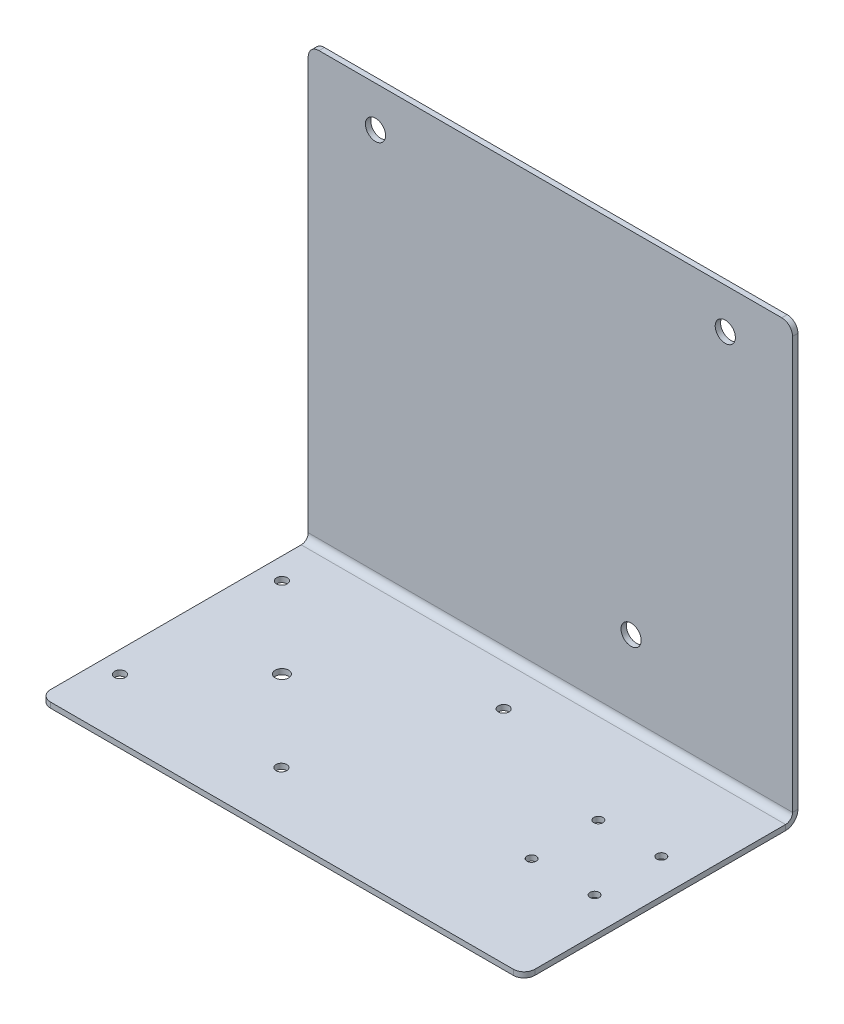
ISO-10303-21;
HEADER;
FILE_DESCRIPTION(('STEP AP214'),'2;1');
FILE_NAME('part.step','',(''),(''),'','','');
FILE_SCHEMA(('AUTOMOTIVE_DESIGN { 1 0 10303 214 1 1 1 1 }'));
ENDSEC;
DATA;
#1=APPLICATION_CONTEXT('core data for automotive mechanical design processes');
#2=APPLICATION_PROTOCOL_DEFINITION('international standard','automotive_design',2000,#1);
#3=PRODUCT_CONTEXT('',#1,'mechanical');
#4=PRODUCT('Part','Part','',(#3));
#5=PRODUCT_RELATED_PRODUCT_CATEGORY('part','',(#4));
#6=PRODUCT_DEFINITION_FORMATION('','',#4);
#7=PRODUCT_DEFINITION_CONTEXT('part definition',#1,'design');
#8=PRODUCT_DEFINITION('design','',#6,#7);
#9=PRODUCT_DEFINITION_SHAPE('','',#8);
#10=(LENGTH_UNIT() NAMED_UNIT(*) SI_UNIT(.MILLI.,.METRE.));
#11=(NAMED_UNIT(*) PLANE_ANGLE_UNIT() SI_UNIT($,.RADIAN.));
#12=(NAMED_UNIT(*) SI_UNIT($,.STERADIAN.) SOLID_ANGLE_UNIT());
#13=UNCERTAINTY_MEASURE_WITH_UNIT(LENGTH_MEASURE(1.E-05),#10,'distance_accuracy_value','');
#14=(GEOMETRIC_REPRESENTATION_CONTEXT(3) GLOBAL_UNCERTAINTY_ASSIGNED_CONTEXT((#13)) GLOBAL_UNIT_ASSIGNED_CONTEXT((#10,
#11,#12)) REPRESENTATION_CONTEXT('',''));
#15=CARTESIAN_POINT('',(0.,0.,0.));
#16=DIRECTION('',(0.,0.,1.));
#17=DIRECTION('',(1.,0.,0.));
#18=AXIS2_PLACEMENT_3D('',#15,#16,#17);
#19=CARTESIAN_POINT('',(114.3,-37.8111595969466,124.171159596947));
#20=DIRECTION('',(-1.,0.,0.));
#21=DIRECTION('',(0.,0.,-1.));
#22=AXIS2_PLACEMENT_3D('',#19,#20,#21);
#23=PLANE('',#22);
#24=DIRECTION('',(0.,0.,-1.));
#25=VECTOR('',#24,1.);
#26=CARTESIAN_POINT('',(114.3,-40.3511595969466,124.171159596947));
#27=LINE('',#26,#25);
#28=CARTESIAN_POINT('',(114.3,-40.3511595969466,124.171159596947));
#29=VERTEX_POINT('',#28);
#30=CARTESIAN_POINT('',(114.3,-40.351159596947,5.84199999999998));
#31=VERTEX_POINT('',#30);
#32=EDGE_CURVE('E69',#29,#31,#27,.T.);
#33=ORIENTED_EDGE('',*,*,#32,.T.);
#34=DIRECTION('',(0.,1.,0.));
#35=VECTOR('',#34,1.);
#36=CARTESIAN_POINT('',(114.3,-37.8111595969462,5.84199999999999));
#37=LINE('',#36,#35);
#38=CARTESIAN_POINT('',(114.3,-37.811159596947,5.84200000000001));
#39=VERTEX_POINT('',#38);
#40=EDGE_CURVE('E134',#31,#39,#37,.T.);
#41=ORIENTED_EDGE('',*,*,#40,.T.);
#42=DIRECTION('',(0.,0.,-1.));
#43=VECTOR('',#42,1.);
#44=CARTESIAN_POINT('',(114.3,-37.8111595969466,124.171159596947));
#45=LINE('',#44,#43);
#46=CARTESIAN_POINT('',(114.3,-37.8111595969466,124.171159596947));
#47=VERTEX_POINT('',#46);
#48=EDGE_CURVE('E136',#47,#39,#45,.T.);
#49=ORIENTED_EDGE('',*,*,#48,.F.);
#50=DIRECTION('',(0.,1.,0.));
#51=VECTOR('',#50,1.);
#52=CARTESIAN_POINT('',(114.3,-37.8111595969466,124.171159596947));
#53=LINE('',#52,#51);
#54=EDGE_CURVE('E238',#29,#47,#53,.T.);
#55=ORIENTED_EDGE('',*,*,#54,.F.);
#56=EDGE_LOOP('',(#33,#41,#49,#55));
#57=FACE_BOUND('',#56,.T.);
#58=ADVANCED_FACE('F45',(#57),#23,.F.);
#59=CARTESIAN_POINT('',(-114.3,-37.8111595969466,124.171159596947));
#60=DIRECTION('',(1.,0.,0.));
#61=DIRECTION('',(0.,0.,1.));
#62=AXIS2_PLACEMENT_3D('',#59,#60,#61);
#63=PLANE('',#62);
#64=DIRECTION('',(0.,0.,1.));
#65=VECTOR('',#64,1.);
#66=CARTESIAN_POINT('',(-114.3,-37.8111595969466,124.171159596947));
#67=LINE('',#66,#65);
#68=CARTESIAN_POINT('',(-114.3,-37.811159596947,5.84199999999999));
#69=VERTEX_POINT('',#68);
#70=CARTESIAN_POINT('',(-114.3,-37.8111595969466,124.171159596947));
#71=VERTEX_POINT('',#70);
#72=EDGE_CURVE('E49',#69,#71,#67,.T.);
#73=ORIENTED_EDGE('',*,*,#72,.F.);
#74=DIRECTION('',(0.,-1.,0.));
#75=VECTOR('',#74,1.);
#76=CARTESIAN_POINT('',(-114.3,-37.8111595969462,5.84199999999999));
#77=LINE('',#76,#75);
#78=CARTESIAN_POINT('',(-114.3,-40.351159596947,5.84199999999998));
#79=VERTEX_POINT('',#78);
#80=EDGE_CURVE('E12',#69,#79,#77,.T.);
#81=ORIENTED_EDGE('',*,*,#80,.T.);
#82=DIRECTION('',(0.,0.,-1.));
#83=VECTOR('',#82,1.);
#84=CARTESIAN_POINT('',(-114.3,-40.3511595969466,124.171159596947));
#85=LINE('',#84,#83);
#86=CARTESIAN_POINT('',(-114.3,-40.3511595969466,124.171159596947));
#87=VERTEX_POINT('',#86);
#88=EDGE_CURVE('E62',#79,#87,#85,.F.);
#89=ORIENTED_EDGE('',*,*,#88,.T.);
#90=DIRECTION('',(0.,1.,0.));
#91=VECTOR('',#90,1.);
#92=CARTESIAN_POINT('',(-114.3,-37.8111595969466,124.171159596947));
#93=LINE('',#92,#91);
#94=EDGE_CURVE('E235',#87,#71,#93,.T.);
#95=ORIENTED_EDGE('',*,*,#94,.T.);
#96=EDGE_LOOP('',(#73,#81,#89,#95));
#97=FACE_BOUND('',#96,.T.);
#98=ADVANCED_FACE('F47',(#97),#63,.F.);
#99=CARTESIAN_POINT('',(-109.22,-40.3511595969466,124.171159596947));
#100=DIRECTION('',(0.,-1.,0.));
#101=DIRECTION('',(-1.,0.,0.));
#102=AXIS2_PLACEMENT_3D('',#99,#100,#101);
#103=PLANE('',#102);
#104=CARTESIAN_POINT('',(98.044,-40.3511595969467,79.7211595969469));
#105=DIRECTION('',(0.,1.,0.));
#106=DIRECTION('',(0.,0.,1.));
#107=AXIS2_PLACEMENT_3D('',#104,#105,#106);
#108=CIRCLE('',#107,2.15899999999999);
#109=CARTESIAN_POINT('',(98.044,-40.3511595969467,81.8801595969469));
#110=VERTEX_POINT('',#109);
#111=EDGE_CURVE('E713',#110,#110,#108,.T.);
#112=ORIENTED_EDGE('',*,*,#111,.T.);
#113=EDGE_LOOP('',(#112));
#114=FACE_BOUND('',#113,.T.);
#115=CARTESIAN_POINT('',(98.044,-40.3511595969469,48.2251595969469));
#116=DIRECTION('',(0.,1.,0.));
#117=DIRECTION('',(0.,0.,1.));
#118=AXIS2_PLACEMENT_3D('',#115,#116,#117);
#119=CIRCLE('',#118,2.15899999999999);
#120=CARTESIAN_POINT('',(98.044,-40.3511595969468,50.3841595969468));
#121=VERTEX_POINT('',#120);
#122=EDGE_CURVE('E707',#121,#121,#119,.T.);
#123=ORIENTED_EDGE('',*,*,#122,.T.);
#124=EDGE_LOOP('',(#123));
#125=FACE_BOUND('',#124,.T.);
#126=CARTESIAN_POINT('',(68.326,-40.3511595969469,48.2251595969469));
#127=DIRECTION('',(0.,1.,0.));
#128=DIRECTION('',(0.,0.,1.));
#129=AXIS2_PLACEMENT_3D('',#126,#127,#128);
#130=CIRCLE('',#129,2.15900000000001);
#131=CARTESIAN_POINT('',(68.326,-40.3511595969468,50.3841595969469));
#132=VERTEX_POINT('',#131);
#133=EDGE_CURVE('E701',#132,#132,#130,.T.);
#134=ORIENTED_EDGE('',*,*,#133,.T.);
#135=EDGE_LOOP('',(#134));
#136=FACE_BOUND('',#135,.T.);
#137=CARTESIAN_POINT('',(68.326,-40.3511595969467,79.7211595969468));
#138=DIRECTION('',(0.,1.,0.));
#139=DIRECTION('',(0.,0.,1.));
#140=AXIS2_PLACEMENT_3D('',#137,#138,#139);
#141=CIRCLE('',#140,2.15900000000001);
#142=CARTESIAN_POINT('',(68.326,-40.3511595969467,81.8801595969469));
#143=VERTEX_POINT('',#142);
#144=EDGE_CURVE('E695',#143,#143,#141,.T.);
#145=ORIENTED_EDGE('',*,*,#144,.T.);
#146=EDGE_LOOP('',(#145));
#147=FACE_BOUND('',#146,.T.);
#148=CARTESIAN_POINT('',(-104.14,-40.3511595969467,101.565159596947));
#149=DIRECTION('',(0.,1.,0.));
#150=DIRECTION('',(0.,0.,1.));
#151=AXIS2_PLACEMENT_3D('',#148,#149,#150);
#152=CIRCLE('',#151,2.53999999999999);
#153=CARTESIAN_POINT('',(-104.14,-40.3511595969467,104.105159596947));
#154=VERTEX_POINT('',#153);
#155=EDGE_CURVE('E689',#154,#154,#152,.T.);
#156=ORIENTED_EDGE('',*,*,#155,.T.);
#157=EDGE_LOOP('',(#156));
#158=FACE_BOUND('',#157,.T.);
#159=CARTESIAN_POINT('',(-27.94,-40.3511595969467,101.565159596947));
#160=DIRECTION('',(0.,1.,0.));
#161=DIRECTION('',(0.,0.,1.));
#162=AXIS2_PLACEMENT_3D('',#159,#160,#161);
#163=CIRCLE('',#162,2.53999999999999);
#164=CARTESIAN_POINT('',(-27.94,-40.3511595969467,104.105159596947));
#165=VERTEX_POINT('',#164);
#166=EDGE_CURVE('E683',#165,#165,#163,.T.);
#167=ORIENTED_EDGE('',*,*,#166,.T.);
#168=EDGE_LOOP('',(#167));
#169=FACE_BOUND('',#168,.T.);
#170=CARTESIAN_POINT('',(0.507999999999985,-40.3511595969469,25.1111595969469));
#171=DIRECTION('',(0.,1.,0.));
#172=DIRECTION('',(0.,0.,1.));
#173=AXIS2_PLACEMENT_3D('',#170,#171,#172);
#174=CIRCLE('',#173,2.54);
#175=CARTESIAN_POINT('',(0.507999999999985,-40.3511595969469,27.6511595969469));
#176=VERTEX_POINT('',#175);
#177=EDGE_CURVE('E677',#176,#176,#174,.T.);
#178=ORIENTED_EDGE('',*,*,#177,.T.);
#179=EDGE_LOOP('',(#178));
#180=FACE_BOUND('',#179,.T.);
#181=CARTESIAN_POINT('',(-66.04,-40.3511595969468,63.2111595969469));
#182=DIRECTION('',(0.,1.,0.));
#183=DIRECTION('',(0.,0.,1.));
#184=AXIS2_PLACEMENT_3D('',#181,#182,#183);
#185=CIRCLE('',#184,3.175);
#186=CARTESIAN_POINT('',(-66.04,-40.3511595969468,66.3861595969469));
#187=VERTEX_POINT('',#186);
#188=EDGE_CURVE('E671',#187,#187,#185,.T.);
#189=ORIENTED_EDGE('',*,*,#188,.T.);
#190=EDGE_LOOP('',(#189));
#191=FACE_BOUND('',#190,.T.);
#192=CARTESIAN_POINT('',(-104.14,-40.3511595969469,25.1111595969469));
#193=DIRECTION('',(0.,1.,0.));
#194=DIRECTION('',(0.,0.,1.));
#195=AXIS2_PLACEMENT_3D('',#192,#193,#194);
#196=CIRCLE('',#195,2.54);
#197=CARTESIAN_POINT('',(-104.14,-40.3511595969469,27.6511595969469));
#198=VERTEX_POINT('',#197);
#199=EDGE_CURVE('E178',#198,#198,#196,.T.);
#200=ORIENTED_EDGE('',*,*,#199,.T.);
#201=EDGE_LOOP('',(#200));
#202=FACE_BOUND('',#201,.T.);
#203=ORIENTED_EDGE('',*,*,#88,.F.);
#204=DIRECTION('',(1.,0.,0.));
#205=VECTOR('',#204,1.);
#206=CARTESIAN_POINT('',(-109.22,-40.351159596947,5.84199999999998));
#207=LINE('',#206,#205);
#208=EDGE_CURVE('E54',#79,#31,#207,.T.);
#209=ORIENTED_EDGE('',*,*,#208,.T.);
#210=ORIENTED_EDGE('',*,*,#32,.F.);
#211=CARTESIAN_POINT('',(109.22,-40.3511595969466,124.171159596947));
#212=DIRECTION('',(0.,1.,0.));
#213=DIRECTION('',(1.,0.,0.));
#214=AXIS2_PLACEMENT_3D('',#211,#212,#213);
#215=CIRCLE('',#214,5.08);
#216=CARTESIAN_POINT('',(109.22,-40.3511595969466,129.251159596947));
#217=VERTEX_POINT('',#216);
#218=EDGE_CURVE('E230',#217,#29,#215,.T.);
#219=ORIENTED_EDGE('',*,*,#218,.F.);
#220=DIRECTION('',(-1.,0.,0.));
#221=VECTOR('',#220,1.);
#222=CARTESIAN_POINT('',(-109.22,-40.3511595969466,129.251159596947));
#223=LINE('',#222,#221);
#224=CARTESIAN_POINT('',(-109.22,-40.3511595969466,129.251159596947));
#225=VERTEX_POINT('',#224);
#226=EDGE_CURVE('E229',#225,#217,#223,.F.);
#227=ORIENTED_EDGE('',*,*,#226,.F.);
#228=CARTESIAN_POINT('',(-109.22,-40.3511595969466,124.171159596947));
#229=DIRECTION('',(0.,1.,0.));
#230=DIRECTION('',(1.,0.,0.));
#231=AXIS2_PLACEMENT_3D('',#228,#229,#230);
#232=CIRCLE('',#231,5.08);
#233=EDGE_CURVE('E181',#87,#225,#232,.T.);
#234=ORIENTED_EDGE('',*,*,#233,.F.);
#235=EDGE_LOOP('',(#203,#209,#210,#219,#227,#234));
#236=FACE_BOUND('',#235,.T.);
#237=ADVANCED_FACE('F253',(#114,#125,#136,#147,#158,#169,#180,#191,#202,#236),#103,.T.);
#238=CARTESIAN_POINT('',(109.22,-37.8111595969466,124.171159596947));
#239=DIRECTION('',(0.,-1.,0.));
#240=DIRECTION('',(-1.,0.,0.));
#241=AXIS2_PLACEMENT_3D('',#238,#239,#240);
#242=CYLINDRICAL_SURFACE('',#241,5.08);
#243=DIRECTION('',(0.,1.,0.));
#244=VECTOR('',#243,1.);
#245=CARTESIAN_POINT('',(109.22,-37.8111595969466,129.251159596947));
#246=LINE('',#245,#244);
#247=CARTESIAN_POINT('',(109.22,-37.8111595969466,129.251159596947));
#248=VERTEX_POINT('',#247);
#249=EDGE_CURVE('E159',#217,#248,#246,.T.);
#250=ORIENTED_EDGE('',*,*,#249,.F.);
#251=ORIENTED_EDGE('',*,*,#218,.T.);
#252=ORIENTED_EDGE('',*,*,#54,.T.);
#253=CARTESIAN_POINT('',(109.22,-37.8111595969466,124.171159596947));
#254=DIRECTION('',(0.,1.,0.));
#255=DIRECTION('',(1.,0.,0.));
#256=AXIS2_PLACEMENT_3D('',#253,#254,#255);
#257=CIRCLE('',#256,5.08);
#258=EDGE_CURVE('E150',#248,#47,#257,.T.);
#259=ORIENTED_EDGE('',*,*,#258,.F.);
#260=EDGE_LOOP('',(#250,#251,#252,#259));
#261=FACE_BOUND('',#260,.T.);
#262=ADVANCED_FACE('F266',(#261),#242,.T.);
#263=CARTESIAN_POINT('',(-109.22,-37.8111595969466,124.171159596947));
#264=DIRECTION('',(0.,-1.,0.));
#265=DIRECTION('',(-1.,0.,0.));
#266=AXIS2_PLACEMENT_3D('',#263,#264,#265);
#267=CYLINDRICAL_SURFACE('',#266,5.08);
#268=ORIENTED_EDGE('',*,*,#94,.F.);
#269=ORIENTED_EDGE('',*,*,#233,.T.);
#270=DIRECTION('',(0.,1.,0.));
#271=VECTOR('',#270,1.);
#272=CARTESIAN_POINT('',(-109.22,-37.8111595969466,129.251159596947));
#273=LINE('',#272,#271);
#274=CARTESIAN_POINT('',(-109.22,-37.8111595969466,129.251159596947));
#275=VERTEX_POINT('',#274);
#276=EDGE_CURVE('E239',#225,#275,#273,.T.);
#277=ORIENTED_EDGE('',*,*,#276,.T.);
#278=CARTESIAN_POINT('',(-109.22,-37.8111595969466,124.171159596947));
#279=DIRECTION('',(0.,1.,0.));
#280=DIRECTION('',(-1.,0.,0.));
#281=AXIS2_PLACEMENT_3D('',#278,#279,#280);
#282=CIRCLE('',#281,5.08);
#283=EDGE_CURVE('E221',#71,#275,#282,.T.);
#284=ORIENTED_EDGE('',*,*,#283,.F.);
#285=EDGE_LOOP('',(#268,#269,#277,#284));
#286=FACE_BOUND('',#285,.T.);
#287=ADVANCED_FACE('F251',(#286),#267,.T.);
#288=CARTESIAN_POINT('',(109.22,-37.8111595969466,129.251159596947));
#289=DIRECTION('',(0.,0.,-1.));
#290=DIRECTION('',(1.,0.,0.));
#291=AXIS2_PLACEMENT_3D('',#288,#289,#290);
#292=PLANE('',#291);
#293=ORIENTED_EDGE('',*,*,#226,.T.);
#294=ORIENTED_EDGE('',*,*,#249,.T.);
#295=DIRECTION('',(1.,0.,0.));
#296=VECTOR('',#295,1.);
#297=CARTESIAN_POINT('',(109.22,-37.8111595969466,129.251159596947));
#298=LINE('',#297,#296);
#299=EDGE_CURVE('E224',#275,#248,#298,.T.);
#300=ORIENTED_EDGE('',*,*,#299,.F.);
#301=ORIENTED_EDGE('',*,*,#276,.F.);
#302=EDGE_LOOP('',(#293,#294,#300,#301));
#303=FACE_BOUND('',#302,.T.);
#304=ADVANCED_FACE('F256',(#303),#292,.F.);
#305=CARTESIAN_POINT('',(-109.22,-37.8111595969466,124.171159596947));
#306=DIRECTION('',(0.,-1.,0.));
#307=DIRECTION('',(-1.,0.,0.));
#308=AXIS2_PLACEMENT_3D('',#305,#306,#307);
#309=PLANE('',#308);
#310=CARTESIAN_POINT('',(98.044,-37.8111595969467,79.7211595969468));
#311=DIRECTION('',(0.,1.,0.));
#312=DIRECTION('',(0.,0.,1.));
#313=AXIS2_PLACEMENT_3D('',#310,#311,#312);
#314=CIRCLE('',#313,2.15899999999999);
#315=CARTESIAN_POINT('',(98.044,-37.8111595969467,81.8801595969469));
#316=VERTEX_POINT('',#315);
#317=EDGE_CURVE('E710',#316,#316,#314,.T.);
#318=ORIENTED_EDGE('',*,*,#317,.F.);
#319=EDGE_LOOP('',(#318));
#320=FACE_BOUND('',#319,.T.);
#321=CARTESIAN_POINT('',(98.044,-37.8111595969469,48.2251595969468));
#322=DIRECTION('',(0.,1.,0.));
#323=DIRECTION('',(0.,0.,1.));
#324=AXIS2_PLACEMENT_3D('',#321,#322,#323);
#325=CIRCLE('',#324,2.15899999999999);
#326=CARTESIAN_POINT('',(98.044,-37.8111595969468,50.3841595969468));
#327=VERTEX_POINT('',#326);
#328=EDGE_CURVE('E704',#327,#327,#325,.T.);
#329=ORIENTED_EDGE('',*,*,#328,.F.);
#330=EDGE_LOOP('',(#329));
#331=FACE_BOUND('',#330,.T.);
#332=CARTESIAN_POINT('',(68.326,-37.8111595969469,48.2251595969468));
#333=DIRECTION('',(0.,1.,0.));
#334=DIRECTION('',(0.,0.,1.));
#335=AXIS2_PLACEMENT_3D('',#332,#333,#334);
#336=CIRCLE('',#335,2.15900000000001);
#337=CARTESIAN_POINT('',(68.326,-37.8111595969468,50.3841595969469));
#338=VERTEX_POINT('',#337);
#339=EDGE_CURVE('E698',#338,#338,#336,.T.);
#340=ORIENTED_EDGE('',*,*,#339,.F.);
#341=EDGE_LOOP('',(#340));
#342=FACE_BOUND('',#341,.T.);
#343=CARTESIAN_POINT('',(68.326,-37.8111595969467,79.7211595969468));
#344=DIRECTION('',(0.,1.,0.));
#345=DIRECTION('',(0.,0.,1.));
#346=AXIS2_PLACEMENT_3D('',#343,#344,#345);
#347=CIRCLE('',#346,2.15900000000001);
#348=CARTESIAN_POINT('',(68.326,-37.8111595969467,81.8801595969469));
#349=VERTEX_POINT('',#348);
#350=EDGE_CURVE('E692',#349,#349,#347,.T.);
#351=ORIENTED_EDGE('',*,*,#350,.F.);
#352=EDGE_LOOP('',(#351));
#353=FACE_BOUND('',#352,.T.);
#354=CARTESIAN_POINT('',(-104.14,-37.8111595969467,101.565159596947));
#355=DIRECTION('',(0.,1.,0.));
#356=DIRECTION('',(0.,0.,1.));
#357=AXIS2_PLACEMENT_3D('',#354,#355,#356);
#358=CIRCLE('',#357,2.53999999999999);
#359=CARTESIAN_POINT('',(-104.14,-37.8111595969467,104.105159596947));
#360=VERTEX_POINT('',#359);
#361=EDGE_CURVE('E686',#360,#360,#358,.T.);
#362=ORIENTED_EDGE('',*,*,#361,.F.);
#363=EDGE_LOOP('',(#362));
#364=FACE_BOUND('',#363,.T.);
#365=CARTESIAN_POINT('',(-27.94,-37.8111595969467,101.565159596947));
#366=DIRECTION('',(0.,1.,0.));
#367=DIRECTION('',(0.,0.,1.));
#368=AXIS2_PLACEMENT_3D('',#365,#366,#367);
#369=CIRCLE('',#368,2.53999999999999);
#370=CARTESIAN_POINT('',(-27.94,-37.8111595969467,104.105159596947));
#371=VERTEX_POINT('',#370);
#372=EDGE_CURVE('E680',#371,#371,#369,.T.);
#373=ORIENTED_EDGE('',*,*,#372,.F.);
#374=EDGE_LOOP('',(#373));
#375=FACE_BOUND('',#374,.T.);
#376=CARTESIAN_POINT('',(0.507999999999985,-37.8111595969469,25.1111595969469));
#377=DIRECTION('',(0.,1.,0.));
#378=DIRECTION('',(0.,0.,1.));
#379=AXIS2_PLACEMENT_3D('',#376,#377,#378);
#380=CIRCLE('',#379,2.54);
#381=CARTESIAN_POINT('',(0.507999999999985,-37.8111595969469,27.6511595969469));
#382=VERTEX_POINT('',#381);
#383=EDGE_CURVE('E674',#382,#382,#380,.T.);
#384=ORIENTED_EDGE('',*,*,#383,.F.);
#385=EDGE_LOOP('',(#384));
#386=FACE_BOUND('',#385,.T.);
#387=CARTESIAN_POINT('',(-66.04,-37.8111595969468,63.2111595969469));
#388=DIRECTION('',(0.,1.,0.));
#389=DIRECTION('',(0.,0.,1.));
#390=AXIS2_PLACEMENT_3D('',#387,#388,#389);
#391=CIRCLE('',#390,3.175);
#392=CARTESIAN_POINT('',(-66.04,-37.8111595969468,66.3861595969469));
#393=VERTEX_POINT('',#392);
#394=EDGE_CURVE('E667',#393,#393,#391,.T.);
#395=ORIENTED_EDGE('',*,*,#394,.F.);
#396=EDGE_LOOP('',(#395));
#397=FACE_BOUND('',#396,.T.);
#398=CARTESIAN_POINT('',(-104.14,-37.8111595969469,25.1111595969469));
#399=DIRECTION('',(0.,1.,0.));
#400=DIRECTION('',(0.,0.,1.));
#401=AXIS2_PLACEMENT_3D('',#398,#399,#400);
#402=CIRCLE('',#401,2.54);
#403=CARTESIAN_POINT('',(-104.14,-37.8111595969469,27.6511595969469));
#404=VERTEX_POINT('',#403);
#405=EDGE_CURVE('E670',#404,#404,#402,.T.);
#406=ORIENTED_EDGE('',*,*,#405,.F.);
#407=EDGE_LOOP('',(#406));
#408=FACE_BOUND('',#407,.T.);
#409=DIRECTION('',(1.,0.,0.));
#410=VECTOR('',#409,1.);
#411=CARTESIAN_POINT('',(-109.22,-37.811159596947,5.84199999999999));
#412=LINE('',#411,#410);
#413=EDGE_CURVE('E141',#69,#39,#412,.T.);
#414=ORIENTED_EDGE('',*,*,#413,.F.);
#415=ORIENTED_EDGE('',*,*,#72,.T.);
#416=ORIENTED_EDGE('',*,*,#283,.T.);
#417=ORIENTED_EDGE('',*,*,#299,.T.);
#418=ORIENTED_EDGE('',*,*,#258,.T.);
#419=ORIENTED_EDGE('',*,*,#48,.T.);
#420=EDGE_LOOP('',(#414,#415,#416,#417,#418,#419));
#421=FACE_BOUND('',#420,.T.);
#422=ADVANCED_FACE('F146',(#320,#331,#342,#353,#364,#375,#386,#397,#408,#421),#309,.F.);
#423=CARTESIAN_POINT('',(-109.22,160.02,2.54));
#424=DIRECTION('',(0.,0.,-1.));
#425=DIRECTION('',(-1.,0.,0.));
#426=AXIS2_PLACEMENT_3D('',#423,#424,#425);
#427=CYLINDRICAL_SURFACE('',#426,5.08);
#428=DIRECTION('',(0.,0.,1.));
#429=VECTOR('',#428,1.);
#430=CARTESIAN_POINT('',(-109.22,165.1,2.54));
#431=LINE('',#430,#429);
#432=CARTESIAN_POINT('',(-109.22,165.1,0.));
#433=VERTEX_POINT('',#432);
#434=CARTESIAN_POINT('',(-109.22,165.1,2.54));
#435=VERTEX_POINT('',#434);
#436=EDGE_CURVE('E208',#433,#435,#431,.T.);
#437=ORIENTED_EDGE('',*,*,#436,.F.);
#438=CARTESIAN_POINT('',(-109.22,160.02,0.));
#439=DIRECTION('',(0.,0.,1.));
#440=DIRECTION('',(1.,0.,0.));
#441=AXIS2_PLACEMENT_3D('',#438,#439,#440);
#442=CIRCLE('',#441,5.08);
#443=CARTESIAN_POINT('',(-114.3,160.02,0.));
#444=VERTEX_POINT('',#443);
#445=EDGE_CURVE('E215',#433,#444,#442,.T.);
#446=ORIENTED_EDGE('',*,*,#445,.T.);
#447=DIRECTION('',(0.,0.,1.));
#448=VECTOR('',#447,1.);
#449=CARTESIAN_POINT('',(-114.3,160.02,2.54));
#450=LINE('',#449,#448);
#451=CARTESIAN_POINT('',(-114.3,160.02,2.54));
#452=VERTEX_POINT('',#451);
#453=EDGE_CURVE('E213',#444,#452,#450,.T.);
#454=ORIENTED_EDGE('',*,*,#453,.T.);
#455=CARTESIAN_POINT('',(-109.22,160.02,2.54));
#456=DIRECTION('',(0.,0.,1.));
#457=DIRECTION('',(1.,0.,0.));
#458=AXIS2_PLACEMENT_3D('',#455,#456,#457);
#459=CIRCLE('',#458,5.08);
#460=EDGE_CURVE('E187',#435,#452,#459,.T.);
#461=ORIENTED_EDGE('',*,*,#460,.F.);
#462=EDGE_LOOP('',(#437,#446,#454,#461));
#463=FACE_BOUND('',#462,.T.);
#464=ADVANCED_FACE('F284',(#463),#427,.T.);
#465=CARTESIAN_POINT('',(109.22,165.1,2.54));
#466=DIRECTION('',(0.,-1.,0.));
#467=DIRECTION('',(-1.,0.,0.));
#468=AXIS2_PLACEMENT_3D('',#465,#466,#467);
#469=PLANE('',#468);
#470=DIRECTION('',(0.,0.,1.));
#471=VECTOR('',#470,1.);
#472=CARTESIAN_POINT('',(109.22,165.1,2.54));
#473=LINE('',#472,#471);
#474=CARTESIAN_POINT('',(109.22,165.1,0.));
#475=VERTEX_POINT('',#474);
#476=CARTESIAN_POINT('',(109.22,165.1,2.54));
#477=VERTEX_POINT('',#476);
#478=EDGE_CURVE('E203',#475,#477,#473,.T.);
#479=ORIENTED_EDGE('',*,*,#478,.F.);
#480=DIRECTION('',(-1.,0.,0.));
#481=VECTOR('',#480,1.);
#482=CARTESIAN_POINT('',(-109.22,165.1,0.));
#483=LINE('',#482,#481);
#484=EDGE_CURVE('E210',#475,#433,#483,.T.);
#485=ORIENTED_EDGE('',*,*,#484,.T.);
#486=ORIENTED_EDGE('',*,*,#436,.T.);
#487=DIRECTION('',(-1.,0.,0.));
#488=VECTOR('',#487,1.);
#489=CARTESIAN_POINT('',(109.22,165.1,2.54));
#490=LINE('',#489,#488);
#491=EDGE_CURVE('E190',#477,#435,#490,.T.);
#492=ORIENTED_EDGE('',*,*,#491,.F.);
#493=EDGE_LOOP('',(#479,#485,#486,#492));
#494=FACE_BOUND('',#493,.T.);
#495=ADVANCED_FACE('F297',(#494),#469,.F.);
#496=CARTESIAN_POINT('',(109.22,160.02,2.54));
#497=DIRECTION('',(0.,0.,-1.));
#498=DIRECTION('',(-1.,0.,0.));
#499=AXIS2_PLACEMENT_3D('',#496,#497,#498);
#500=CYLINDRICAL_SURFACE('',#499,5.08);
#501=DIRECTION('',(0.,0.,1.));
#502=VECTOR('',#501,1.);
#503=CARTESIAN_POINT('',(114.3,160.02,2.54));
#504=LINE('',#503,#502);
#505=CARTESIAN_POINT('',(114.3,160.02,0.));
#506=VERTEX_POINT('',#505);
#507=CARTESIAN_POINT('',(114.3,160.02,2.54));
#508=VERTEX_POINT('',#507);
#509=EDGE_CURVE('E182',#506,#508,#504,.T.);
#510=ORIENTED_EDGE('',*,*,#509,.F.);
#511=CARTESIAN_POINT('',(109.22,160.02,0.));
#512=DIRECTION('',(0.,0.,1.));
#513=DIRECTION('',(1.,0.,0.));
#514=AXIS2_PLACEMENT_3D('',#511,#512,#513);
#515=CIRCLE('',#514,5.08);
#516=EDGE_CURVE('E205',#506,#475,#515,.T.);
#517=ORIENTED_EDGE('',*,*,#516,.T.);
#518=ORIENTED_EDGE('',*,*,#478,.T.);
#519=CARTESIAN_POINT('',(109.22,160.02,2.54));
#520=DIRECTION('',(0.,0.,1.));
#521=DIRECTION('',(1.,0.,0.));
#522=AXIS2_PLACEMENT_3D('',#519,#520,#521);
#523=CIRCLE('',#522,5.08);
#524=EDGE_CURVE('E193',#508,#477,#523,.T.);
#525=ORIENTED_EDGE('',*,*,#524,.F.);
#526=EDGE_LOOP('',(#510,#517,#518,#525));
#527=FACE_BOUND('',#526,.T.);
#528=ADVANCED_FACE('F305',(#527),#500,.T.);
#529=CARTESIAN_POINT('',(-109.22,-160.02,2.54));
#530=DIRECTION('',(0.,0.,-1.));
#531=DIRECTION('',(-1.,0.,0.));
#532=AXIS2_PLACEMENT_3D('',#529,#530,#531);
#533=PLANE('',#532);
#534=CARTESIAN_POINT('',(-82.55,146.05,2.54));
#535=DIRECTION('',(0.,0.,1.));
#536=DIRECTION('',(1.,0.,0.));
#537=AXIS2_PLACEMENT_3D('',#534,#535,#536);
#538=CIRCLE('',#537,4.7625);
#539=CARTESIAN_POINT('',(-77.7875,146.05,2.54));
#540=VERTEX_POINT('',#539);
#541=EDGE_CURVE('E638',#540,#540,#538,.T.);
#542=ORIENTED_EDGE('',*,*,#541,.F.);
#543=EDGE_LOOP('',(#542));
#544=FACE_BOUND('',#543,.T.);
#545=CARTESIAN_POINT('',(82.55,146.05,2.54));
#546=DIRECTION('',(0.,0.,1.));
#547=DIRECTION('',(1.,0.,0.));
#548=AXIS2_PLACEMENT_3D('',#545,#546,#547);
#549=CIRCLE('',#548,4.7625);
#550=CARTESIAN_POINT('',(87.3125,146.05,2.54));
#551=VERTEX_POINT('',#550);
#552=EDGE_CURVE('E642',#551,#551,#549,.T.);
#553=ORIENTED_EDGE('',*,*,#552,.F.);
#554=EDGE_LOOP('',(#553));
#555=FACE_BOUND('',#554,.T.);
#556=CARTESIAN_POINT('',(38.1,0.,2.54));
#557=DIRECTION('',(0.,0.,1.));
#558=DIRECTION('',(1.,0.,0.));
#559=AXIS2_PLACEMENT_3D('',#556,#557,#558);
#560=CIRCLE('',#559,4.7625);
#561=CARTESIAN_POINT('',(42.8625,0.,2.54));
#562=VERTEX_POINT('',#561);
#563=EDGE_CURVE('E646',#562,#562,#560,.T.);
#564=ORIENTED_EDGE('',*,*,#563,.F.);
#565=EDGE_LOOP('',(#564));
#566=FACE_BOUND('',#565,.T.);
#567=DIRECTION('',(0.,-1.,0.));
#568=VECTOR('',#567,1.);
#569=CARTESIAN_POINT('',(-114.3,-160.02,2.54));
#570=LINE('',#569,#568);
#571=CARTESIAN_POINT('',(-114.3,-34.509159596947,2.54));
#572=VERTEX_POINT('',#571);
#573=EDGE_CURVE('E201',#452,#572,#570,.T.);
#574=ORIENTED_EDGE('',*,*,#573,.T.);
#575=DIRECTION('',(1.,0.,0.));
#576=VECTOR('',#575,1.);
#577=CARTESIAN_POINT('',(-109.22,-34.509159596947,2.54));
#578=LINE('',#577,#576);
#579=CARTESIAN_POINT('',(114.3,-34.509159596947,2.54));
#580=VERTEX_POINT('',#579);
#581=EDGE_CURVE('E198',#572,#580,#578,.T.);
#582=ORIENTED_EDGE('',*,*,#581,.T.);
#583=DIRECTION('',(0.,1.,0.));
#584=VECTOR('',#583,1.);
#585=CARTESIAN_POINT('',(114.3,-160.02,2.54));
#586=LINE('',#585,#584);
#587=EDGE_CURVE('E196',#580,#508,#586,.T.);
#588=ORIENTED_EDGE('',*,*,#587,.T.);
#589=ORIENTED_EDGE('',*,*,#524,.T.);
#590=ORIENTED_EDGE('',*,*,#491,.T.);
#591=ORIENTED_EDGE('',*,*,#460,.T.);
#592=EDGE_LOOP('',(#574,#582,#588,#589,#590,#591));
#593=FACE_BOUND('',#592,.T.);
#594=ADVANCED_FACE('F313',(#544,#555,#566,#593),#533,.F.);
#595=CARTESIAN_POINT('',(114.3,-160.02,2.54));
#596=DIRECTION('',(-1.,0.,0.));
#597=DIRECTION('',(0.,1.,0.));
#598=AXIS2_PLACEMENT_3D('',#595,#596,#597);
#599=PLANE('',#598);
#600=DIRECTION('',(0.,0.,1.));
#601=VECTOR('',#600,1.);
#602=CARTESIAN_POINT('',(114.3,-34.509159596947,2.54000000000088));
#603=LINE('',#602,#601);
#604=CARTESIAN_POINT('',(114.3,-34.5091595969469,0.));
#605=VERTEX_POINT('',#604);
#606=EDGE_CURVE('E164',#605,#580,#603,.T.);
#607=ORIENTED_EDGE('',*,*,#606,.F.);
#608=DIRECTION('',(0.,1.,0.));
#609=VECTOR('',#608,1.);
#610=CARTESIAN_POINT('',(114.3,-160.02,0.));
#611=LINE('',#610,#609);
#612=EDGE_CURVE('E185',#605,#506,#611,.T.);
#613=ORIENTED_EDGE('',*,*,#612,.T.);
#614=ORIENTED_EDGE('',*,*,#509,.T.);
#615=ORIENTED_EDGE('',*,*,#587,.F.);
#616=EDGE_LOOP('',(#607,#613,#614,#615));
#617=FACE_BOUND('',#616,.T.);
#618=ADVANCED_FACE('F319',(#617),#599,.F.);
#619=CARTESIAN_POINT('',(-109.22,-160.02,0.));
#620=DIRECTION('',(0.,0.,-1.));
#621=DIRECTION('',(-1.,0.,0.));
#622=AXIS2_PLACEMENT_3D('',#619,#620,#621);
#623=PLANE('',#622);
#624=CARTESIAN_POINT('',(-82.55,146.05,0.));
#625=DIRECTION('',(0.,0.,1.));
#626=DIRECTION('',(1.,0.,0.));
#627=AXIS2_PLACEMENT_3D('',#624,#625,#626);
#628=CIRCLE('',#627,4.7625);
#629=CARTESIAN_POINT('',(-77.7875,146.05,0.));
#630=VERTEX_POINT('',#629);
#631=EDGE_CURVE('E716',#630,#630,#628,.T.);
#632=ORIENTED_EDGE('',*,*,#631,.T.);
#633=EDGE_LOOP('',(#632));
#634=FACE_BOUND('',#633,.T.);
#635=CARTESIAN_POINT('',(82.55,146.05,0.));
#636=DIRECTION('',(0.,0.,1.));
#637=DIRECTION('',(1.,0.,0.));
#638=AXIS2_PLACEMENT_3D('',#635,#636,#637);
#639=CIRCLE('',#638,4.7625);
#640=CARTESIAN_POINT('',(87.3125,146.05,0.));
#641=VERTEX_POINT('',#640);
#642=EDGE_CURVE('E658',#641,#641,#639,.T.);
#643=ORIENTED_EDGE('',*,*,#642,.T.);
#644=EDGE_LOOP('',(#643));
#645=FACE_BOUND('',#644,.T.);
#646=CARTESIAN_POINT('',(38.1,0.,0.));
#647=DIRECTION('',(0.,0.,1.));
#648=DIRECTION('',(1.,0.,0.));
#649=AXIS2_PLACEMENT_3D('',#646,#647,#648);
#650=CIRCLE('',#649,4.7625);
#651=CARTESIAN_POINT('',(42.8625,0.,0.));
#652=VERTEX_POINT('',#651);
#653=EDGE_CURVE('E659',#652,#652,#650,.T.);
#654=ORIENTED_EDGE('',*,*,#653,.T.);
#655=EDGE_LOOP('',(#654));
#656=FACE_BOUND('',#655,.T.);
#657=DIRECTION('',(1.,0.,0.));
#658=VECTOR('',#657,1.);
#659=CARTESIAN_POINT('',(-109.22,-34.5091595969469,0.));
#660=LINE('',#659,#658);
#661=CARTESIAN_POINT('',(-114.3,-34.5091595969469,0.));
#662=VERTEX_POINT('',#661);
#663=EDGE_CURVE('E168',#662,#605,#660,.T.);
#664=ORIENTED_EDGE('',*,*,#663,.F.);
#665=DIRECTION('',(0.,1.,0.));
#666=VECTOR('',#665,1.);
#667=CARTESIAN_POINT('',(-114.3,-160.02,0.));
#668=LINE('',#667,#666);
#669=EDGE_CURVE('E179',#444,#662,#668,.F.);
#670=ORIENTED_EDGE('',*,*,#669,.F.);
#671=ORIENTED_EDGE('',*,*,#445,.F.);
#672=ORIENTED_EDGE('',*,*,#484,.F.);
#673=ORIENTED_EDGE('',*,*,#516,.F.);
#674=ORIENTED_EDGE('',*,*,#612,.F.);
#675=EDGE_LOOP('',(#664,#670,#671,#672,#673,#674));
#676=FACE_BOUND('',#675,.T.);
#677=ADVANCED_FACE('F322',(#634,#645,#656,#676),#623,.T.);
#678=CARTESIAN_POINT('',(-114.3,-160.02,2.54));
#679=DIRECTION('',(1.,0.,0.));
#680=DIRECTION('',(0.,-1.,0.));
#681=AXIS2_PLACEMENT_3D('',#678,#679,#680);
#682=PLANE('',#681);
#683=DIRECTION('',(0.,0.,-1.));
#684=VECTOR('',#683,1.);
#685=CARTESIAN_POINT('',(-114.3,-34.509159596947,2.54000000000088));
#686=LINE('',#685,#684);
#687=EDGE_CURVE('E165',#572,#662,#686,.T.);
#688=ORIENTED_EDGE('',*,*,#687,.F.);
#689=ORIENTED_EDGE('',*,*,#573,.F.);
#690=ORIENTED_EDGE('',*,*,#453,.F.);
#691=ORIENTED_EDGE('',*,*,#669,.T.);
#692=EDGE_LOOP('',(#688,#689,#690,#691));
#693=FACE_BOUND('',#692,.T.);
#694=ADVANCED_FACE('F328',(#693),#682,.F.);
#695=CARTESIAN_POINT('',(-114.3,-34.509159596947,5.842));
#696=DIRECTION('',(1.,0.,0.));
#697=DIRECTION('',(0.,0.,-1.));
#698=AXIS2_PLACEMENT_3D('',#695,#696,#697);
#699=PLANE('',#698);
#700=ORIENTED_EDGE('',*,*,#687,.T.);
#701=CARTESIAN_POINT('',(-114.3,-34.509159596947,5.842));
#702=DIRECTION('',(1.,0.,0.));
#703=DIRECTION('',(0.,0.,-1.));
#704=AXIS2_PLACEMENT_3D('',#701,#702,#703);
#705=CIRCLE('',#704,5.842);
#706=EDGE_CURVE('E175',#662,#79,#705,.F.);
#707=ORIENTED_EDGE('',*,*,#706,.T.);
#708=ORIENTED_EDGE('',*,*,#80,.F.);
#709=CARTESIAN_POINT('',(-114.3,-34.509159596947,5.842));
#710=DIRECTION('',(-1.,0.,0.));
#711=DIRECTION('',(0.,0.,1.));
#712=AXIS2_PLACEMENT_3D('',#709,#710,#711);
#713=CIRCLE('',#712,3.302);
#714=EDGE_CURVE('E158',#572,#69,#713,.T.);
#715=ORIENTED_EDGE('',*,*,#714,.F.);
#716=EDGE_LOOP('',(#700,#707,#708,#715));
#717=FACE_BOUND('',#716,.T.);
#718=ADVANCED_FACE('F259',(#717),#699,.F.);
#719=CARTESIAN_POINT('',(114.3,-34.509159596947,5.842));
#720=DIRECTION('',(-1.,0.,0.));
#721=DIRECTION('',(0.,0.,1.));
#722=AXIS2_PLACEMENT_3D('',#719,#720,#721);
#723=PLANE('',#722);
#724=ORIENTED_EDGE('',*,*,#40,.F.);
#725=CARTESIAN_POINT('',(114.3,-34.509159596947,5.842));
#726=DIRECTION('',(1.,0.,0.));
#727=DIRECTION('',(0.,0.,-1.));
#728=AXIS2_PLACEMENT_3D('',#725,#726,#727);
#729=CIRCLE('',#728,5.842);
#730=EDGE_CURVE('E170',#31,#605,#729,.T.);
#731=ORIENTED_EDGE('',*,*,#730,.T.);
#732=ORIENTED_EDGE('',*,*,#606,.T.);
#733=CARTESIAN_POINT('',(114.3,-34.509159596947,5.842));
#734=DIRECTION('',(1.,0.,0.));
#735=DIRECTION('',(0.,0.,-1.));
#736=AXIS2_PLACEMENT_3D('',#733,#734,#735);
#737=CIRCLE('',#736,3.302);
#738=EDGE_CURVE('E156',#39,#580,#737,.T.);
#739=ORIENTED_EDGE('',*,*,#738,.F.);
#740=EDGE_LOOP('',(#724,#731,#732,#739));
#741=FACE_BOUND('',#740,.T.);
#742=ADVANCED_FACE('F162',(#741),#723,.F.);
#743=CARTESIAN_POINT('',(-228.726885475234,-34.509159596947,5.842));
#744=DIRECTION('',(1.,0.,0.));
#745=DIRECTION('',(0.,0.,-1.));
#746=AXIS2_PLACEMENT_3D('',#743,#744,#745);
#747=CYLINDRICAL_SURFACE('',#746,3.302);
#748=ORIENTED_EDGE('',*,*,#738,.T.);
#749=ORIENTED_EDGE('',*,*,#581,.F.);
#750=ORIENTED_EDGE('',*,*,#714,.T.);
#751=ORIENTED_EDGE('',*,*,#413,.T.);
#752=EDGE_LOOP('',(#748,#749,#750,#751));
#753=FACE_BOUND('',#752,.T.);
#754=ADVANCED_FACE('F154',(#753),#747,.F.);
#755=CARTESIAN_POINT('',(-228.726885475234,-34.509159596947,5.842));
#756=DIRECTION('',(1.,0.,0.));
#757=DIRECTION('',(0.,0.,-1.));
#758=AXIS2_PLACEMENT_3D('',#755,#756,#757);
#759=CYLINDRICAL_SURFACE('',#758,5.842);
#760=ORIENTED_EDGE('',*,*,#730,.F.);
#761=ORIENTED_EDGE('',*,*,#208,.F.);
#762=ORIENTED_EDGE('',*,*,#706,.F.);
#763=ORIENTED_EDGE('',*,*,#663,.T.);
#764=EDGE_LOOP('',(#760,#761,#762,#763));
#765=FACE_BOUND('',#764,.T.);
#766=ADVANCED_FACE('F263',(#765),#759,.T.);
#767=CARTESIAN_POINT('',(-104.14,-40.3511595969469,25.1111595969469));
#768=DIRECTION('',(0.,1.,0.));
#769=DIRECTION('',(0.,0.,1.));
#770=AXIS2_PLACEMENT_3D('',#767,#768,#769);
#771=CYLINDRICAL_SURFACE('',#770,2.54);
#772=ORIENTED_EDGE('',*,*,#199,.F.);
#773=EDGE_LOOP('',(#772));
#774=FACE_BOUND('',#773,.T.);
#775=ORIENTED_EDGE('',*,*,#405,.T.);
#776=EDGE_LOOP('',(#775));
#777=FACE_BOUND('',#776,.T.);
#778=ADVANCED_FACE('F356',(#774,#777),#771,.F.);
#779=CARTESIAN_POINT('',(-66.04,-40.3511595969468,63.2111595969469));
#780=DIRECTION('',(0.,1.,0.));
#781=DIRECTION('',(0.,0.,1.));
#782=AXIS2_PLACEMENT_3D('',#779,#780,#781);
#783=CYLINDRICAL_SURFACE('',#782,3.175);
#784=ORIENTED_EDGE('',*,*,#188,.F.);
#785=EDGE_LOOP('',(#784));
#786=FACE_BOUND('',#785,.T.);
#787=ORIENTED_EDGE('',*,*,#394,.T.);
#788=EDGE_LOOP('',(#787));
#789=FACE_BOUND('',#788,.T.);
#790=ADVANCED_FACE('F363',(#786,#789),#783,.F.);
#791=CARTESIAN_POINT('',(0.507999999999985,-40.3511595969469,25.1111595969469));
#792=DIRECTION('',(0.,1.,0.));
#793=DIRECTION('',(0.,0.,1.));
#794=AXIS2_PLACEMENT_3D('',#791,#792,#793);
#795=CYLINDRICAL_SURFACE('',#794,2.54);
#796=ORIENTED_EDGE('',*,*,#177,.F.);
#797=EDGE_LOOP('',(#796));
#798=FACE_BOUND('',#797,.T.);
#799=ORIENTED_EDGE('',*,*,#383,.T.);
#800=EDGE_LOOP('',(#799));
#801=FACE_BOUND('',#800,.T.);
#802=ADVANCED_FACE('F371',(#798,#801),#795,.F.);
#803=CARTESIAN_POINT('',(-27.94,-40.3511595969467,101.565159596947));
#804=DIRECTION('',(0.,1.,0.));
#805=DIRECTION('',(0.,0.,1.));
#806=AXIS2_PLACEMENT_3D('',#803,#804,#805);
#807=CYLINDRICAL_SURFACE('',#806,2.53999999999999);
#808=ORIENTED_EDGE('',*,*,#166,.F.);
#809=EDGE_LOOP('',(#808));
#810=FACE_BOUND('',#809,.T.);
#811=ORIENTED_EDGE('',*,*,#372,.T.);
#812=EDGE_LOOP('',(#811));
#813=FACE_BOUND('',#812,.T.);
#814=ADVANCED_FACE('F379',(#810,#813),#807,.F.);
#815=CARTESIAN_POINT('',(-104.14,-40.3511595969467,101.565159596947));
#816=DIRECTION('',(0.,1.,0.));
#817=DIRECTION('',(0.,0.,1.));
#818=AXIS2_PLACEMENT_3D('',#815,#816,#817);
#819=CYLINDRICAL_SURFACE('',#818,2.53999999999999);
#820=ORIENTED_EDGE('',*,*,#155,.F.);
#821=EDGE_LOOP('',(#820));
#822=FACE_BOUND('',#821,.T.);
#823=ORIENTED_EDGE('',*,*,#361,.T.);
#824=EDGE_LOOP('',(#823));
#825=FACE_BOUND('',#824,.T.);
#826=ADVANCED_FACE('F387',(#822,#825),#819,.F.);
#827=CARTESIAN_POINT('',(68.326,-40.3511595969467,79.7211595969468));
#828=DIRECTION('',(0.,1.,0.));
#829=DIRECTION('',(0.,0.,1.));
#830=AXIS2_PLACEMENT_3D('',#827,#828,#829);
#831=CYLINDRICAL_SURFACE('',#830,2.15900000000001);
#832=ORIENTED_EDGE('',*,*,#144,.F.);
#833=EDGE_LOOP('',(#832));
#834=FACE_BOUND('',#833,.T.);
#835=ORIENTED_EDGE('',*,*,#350,.T.);
#836=EDGE_LOOP('',(#835));
#837=FACE_BOUND('',#836,.T.);
#838=ADVANCED_FACE('F395',(#834,#837),#831,.F.);
#839=CARTESIAN_POINT('',(68.326,-40.3511595969469,48.2251595969469));
#840=DIRECTION('',(0.,1.,0.));
#841=DIRECTION('',(0.,0.,1.));
#842=AXIS2_PLACEMENT_3D('',#839,#840,#841);
#843=CYLINDRICAL_SURFACE('',#842,2.15900000000001);
#844=ORIENTED_EDGE('',*,*,#133,.F.);
#845=EDGE_LOOP('',(#844));
#846=FACE_BOUND('',#845,.T.);
#847=ORIENTED_EDGE('',*,*,#339,.T.);
#848=EDGE_LOOP('',(#847));
#849=FACE_BOUND('',#848,.T.);
#850=ADVANCED_FACE('F403',(#846,#849),#843,.F.);
#851=CARTESIAN_POINT('',(98.044,-40.3511595969469,48.2251595969469));
#852=DIRECTION('',(0.,1.,0.));
#853=DIRECTION('',(0.,0.,1.));
#854=AXIS2_PLACEMENT_3D('',#851,#852,#853);
#855=CYLINDRICAL_SURFACE('',#854,2.15899999999999);
#856=ORIENTED_EDGE('',*,*,#122,.F.);
#857=EDGE_LOOP('',(#856));
#858=FACE_BOUND('',#857,.T.);
#859=ORIENTED_EDGE('',*,*,#328,.T.);
#860=EDGE_LOOP('',(#859));
#861=FACE_BOUND('',#860,.T.);
#862=ADVANCED_FACE('F411',(#858,#861),#855,.F.);
#863=CARTESIAN_POINT('',(98.044,-40.3511595969467,79.7211595969469));
#864=DIRECTION('',(0.,1.,0.));
#865=DIRECTION('',(0.,0.,1.));
#866=AXIS2_PLACEMENT_3D('',#863,#864,#865);
#867=CYLINDRICAL_SURFACE('',#866,2.15899999999999);
#868=ORIENTED_EDGE('',*,*,#111,.F.);
#869=EDGE_LOOP('',(#868));
#870=FACE_BOUND('',#869,.T.);
#871=ORIENTED_EDGE('',*,*,#317,.T.);
#872=EDGE_LOOP('',(#871));
#873=FACE_BOUND('',#872,.T.);
#874=ADVANCED_FACE('F419',(#870,#873),#867,.F.);
#875=CARTESIAN_POINT('',(38.1,0.,0.));
#876=DIRECTION('',(0.,0.,1.));
#877=DIRECTION('',(1.,0.,0.));
#878=AXIS2_PLACEMENT_3D('',#875,#876,#877);
#879=CYLINDRICAL_SURFACE('',#878,4.7625);
#880=ORIENTED_EDGE('',*,*,#653,.F.);
#881=EDGE_LOOP('',(#880));
#882=FACE_BOUND('',#881,.T.);
#883=ORIENTED_EDGE('',*,*,#563,.T.);
#884=EDGE_LOOP('',(#883));
#885=FACE_BOUND('',#884,.T.);
#886=ADVANCED_FACE('F427',(#882,#885),#879,.F.);
#887=CARTESIAN_POINT('',(82.55,146.05,0.));
#888=DIRECTION('',(0.,0.,1.));
#889=DIRECTION('',(1.,0.,0.));
#890=AXIS2_PLACEMENT_3D('',#887,#888,#889);
#891=CYLINDRICAL_SURFACE('',#890,4.7625);
#892=ORIENTED_EDGE('',*,*,#642,.F.);
#893=EDGE_LOOP('',(#892));
#894=FACE_BOUND('',#893,.T.);
#895=ORIENTED_EDGE('',*,*,#552,.T.);
#896=EDGE_LOOP('',(#895));
#897=FACE_BOUND('',#896,.T.);
#898=ADVANCED_FACE('F436',(#894,#897),#891,.F.);
#899=CARTESIAN_POINT('',(-82.55,146.05,0.));
#900=DIRECTION('',(0.,0.,1.));
#901=DIRECTION('',(1.,0.,0.));
#902=AXIS2_PLACEMENT_3D('',#899,#900,#901);
#903=CYLINDRICAL_SURFACE('',#902,4.7625);
#904=ORIENTED_EDGE('',*,*,#631,.F.);
#905=EDGE_LOOP('',(#904));
#906=FACE_BOUND('',#905,.T.);
#907=ORIENTED_EDGE('',*,*,#541,.T.);
#908=EDGE_LOOP('',(#907));
#909=FACE_BOUND('',#908,.T.);
#910=ADVANCED_FACE('F445',(#906,#909),#903,.F.);
#911=CLOSED_SHELL('',(#58,#98,#237,#262,#287,#304,#422,#464,#495,#528,#594,#618,#677,#694,#718,
#742,#754,#766,#778,#790,#802,#814,#826,#838,#850,#862,#874,#886,#898,#910));
#912=MANIFOLD_SOLID_BREP('B2',#911);
#913=ADVANCED_BREP_SHAPE_REPRESENTATION('',(#18,#912),#14);
#914=SHAPE_DEFINITION_REPRESENTATION(#9,#913);
ENDSEC;
END-ISO-10303-21;
